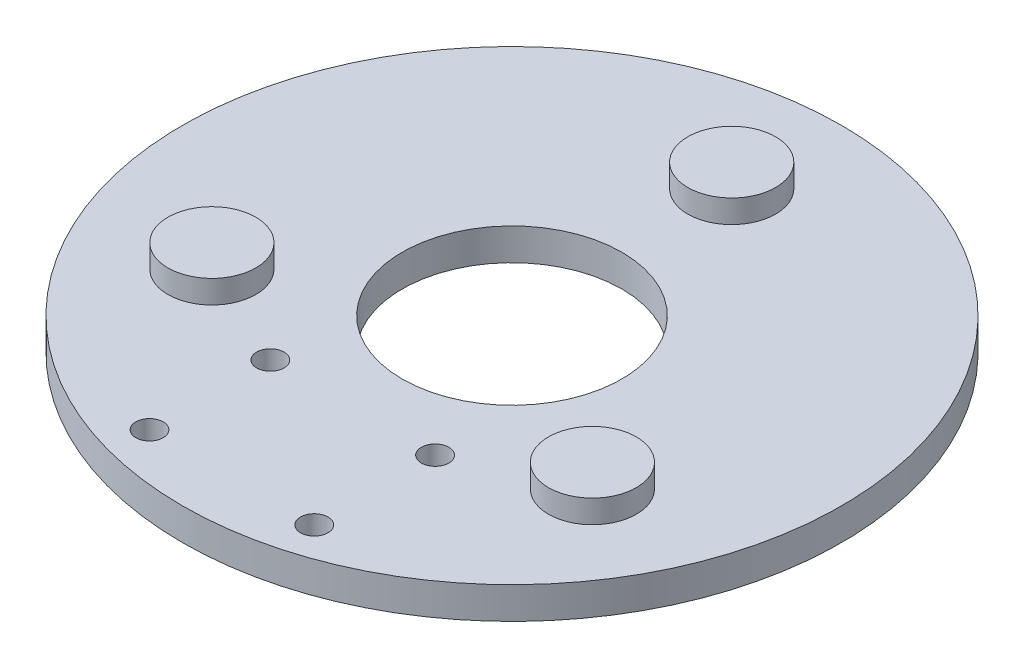
ISO-10303-21;
HEADER;
FILE_DESCRIPTION(('STEP AP214'),'2;1');
FILE_NAME('part.step','',(''),(''),'','','');
FILE_SCHEMA(('AUTOMOTIVE_DESIGN { 1 0 10303 214 1 1 1 1 }'));
ENDSEC;
DATA;
#1=APPLICATION_CONTEXT('core data for automotive mechanical design processes');
#2=APPLICATION_PROTOCOL_DEFINITION('international standard','automotive_design',2000,#1);
#3=PRODUCT_CONTEXT('',#1,'mechanical');
#4=PRODUCT('Part','Part','',(#3));
#5=PRODUCT_RELATED_PRODUCT_CATEGORY('part','',(#4));
#6=PRODUCT_DEFINITION_FORMATION('','',#4);
#7=PRODUCT_DEFINITION_CONTEXT('part definition',#1,'design');
#8=PRODUCT_DEFINITION('design','',#6,#7);
#9=PRODUCT_DEFINITION_SHAPE('','',#8);
#10=(LENGTH_UNIT() NAMED_UNIT(*) SI_UNIT(.MILLI.,.METRE.));
#11=(NAMED_UNIT(*) PLANE_ANGLE_UNIT() SI_UNIT($,.RADIAN.));
#12=(NAMED_UNIT(*) SI_UNIT($,.STERADIAN.) SOLID_ANGLE_UNIT());
#13=UNCERTAINTY_MEASURE_WITH_UNIT(LENGTH_MEASURE(1.E-05),#10,'distance_accuracy_value','');
#14=(GEOMETRIC_REPRESENTATION_CONTEXT(3) GLOBAL_UNCERTAINTY_ASSIGNED_CONTEXT((#13)) GLOBAL_UNIT_ASSIGNED_CONTEXT((#10,
#11,#12)) REPRESENTATION_CONTEXT('',''));
#15=CARTESIAN_POINT('',(0.,0.,0.));
#16=DIRECTION('',(0.,0.,1.));
#17=DIRECTION('',(1.,0.,0.));
#18=AXIS2_PLACEMENT_3D('',#15,#16,#17);
#19=CARTESIAN_POINT('',(0.,7.366,0.));
#20=DIRECTION('',(0.,1.,0.));
#21=DIRECTION('',(0.,0.,1.));
#22=AXIS2_PLACEMENT_3D('',#19,#20,#21);
#23=PLANE('',#22);
#24=CARTESIAN_POINT('',(19.05,7.366,64.77));
#25=DIRECTION('',(0.,1.,0.));
#26=DIRECTION('',(0.,0.,-1.));
#27=AXIS2_PLACEMENT_3D('',#24,#25,#26);
#28=CIRCLE('',#27,3.175);
#29=CARTESIAN_POINT('',(19.05,7.366,61.595));
#30=VERTEX_POINT('',#29);
#31=EDGE_CURVE('E86',#30,#30,#28,.T.);
#32=ORIENTED_EDGE('',*,*,#31,.F.);
#33=EDGE_LOOP('',(#32));
#34=FACE_BOUND('',#33,.T.);
#35=CARTESIAN_POINT('',(-19.05,7.366,36.83));
#36=DIRECTION('',(0.,1.,0.));
#37=DIRECTION('',(0.,0.,-1.));
#38=AXIS2_PLACEMENT_3D('',#35,#36,#37);
#39=CIRCLE('',#38,3.175);
#40=CARTESIAN_POINT('',(-19.05,7.366,33.655));
#41=VERTEX_POINT('',#40);
#42=EDGE_CURVE('E80',#41,#41,#39,.T.);
#43=ORIENTED_EDGE('',*,*,#42,.F.);
#44=EDGE_LOOP('',(#43));
#45=FACE_BOUND('',#44,.T.);
#46=CARTESIAN_POINT('',(19.05,7.366,36.83));
#47=DIRECTION('',(0.,1.,0.));
#48=DIRECTION('',(0.,0.,1.));
#49=AXIS2_PLACEMENT_3D('',#46,#47,#48);
#50=CIRCLE('',#49,3.175);
#51=CARTESIAN_POINT('',(19.05,7.366,40.005));
#52=VERTEX_POINT('',#51);
#53=EDGE_CURVE('E74',#52,#52,#50,.T.);
#54=ORIENTED_EDGE('',*,*,#53,.F.);
#55=EDGE_LOOP('',(#54));
#56=FACE_BOUND('',#55,.T.);
#57=CARTESIAN_POINT('',(-19.05,7.366,64.77));
#58=DIRECTION('',(0.,1.,0.));
#59=DIRECTION('',(0.,0.,1.));
#60=AXIS2_PLACEMENT_3D('',#57,#58,#59);
#61=CIRCLE('',#60,3.175);
#62=CARTESIAN_POINT('',(-19.05,7.366,67.945));
#63=VERTEX_POINT('',#62);
#64=EDGE_CURVE('E68',#63,#63,#61,.T.);
#65=ORIENTED_EDGE('',*,*,#64,.F.);
#66=EDGE_LOOP('',(#65));
#67=FACE_BOUND('',#66,.T.);
#68=CARTESIAN_POINT('',(-43.9940905122494,7.366,25.4000000000002));
#69=DIRECTION('',(0.,1.,0.));
#70=DIRECTION('',(0.,0.,1.));
#71=AXIS2_PLACEMENT_3D('',#68,#69,#70);
#72=CIRCLE('',#71,10.16);
#73=CARTESIAN_POINT('',(-43.9940905122494,7.366,35.5600000000002));
#74=VERTEX_POINT('',#73);
#75=EDGE_CURVE('E56',#74,#74,#72,.T.);
#76=ORIENTED_EDGE('',*,*,#75,.F.);
#77=EDGE_LOOP('',(#76));
#78=FACE_BOUND('',#77,.T.);
#79=CARTESIAN_POINT('',(0.,7.366,0.));
#80=DIRECTION('',(0.,1.,0.));
#81=DIRECTION('',(0.,0.,1.));
#82=AXIS2_PLACEMENT_3D('',#79,#80,#81);
#83=CIRCLE('',#82,25.4);
#84=CARTESIAN_POINT('',(0.,7.366,25.4));
#85=VERTEX_POINT('',#84);
#86=EDGE_CURVE('E42',#85,#85,#83,.T.);
#87=ORIENTED_EDGE('',*,*,#86,.F.);
#88=EDGE_LOOP('',(#87));
#89=FACE_BOUND('',#88,.T.);
#90=CARTESIAN_POINT('',(0.,7.366,0.));
#91=DIRECTION('',(0.,1.,0.));
#92=DIRECTION('',(0.,0.,1.));
#93=AXIS2_PLACEMENT_3D('',#90,#91,#92);
#94=CIRCLE('',#93,76.2);
#95=CARTESIAN_POINT('',(0.,7.366,76.2));
#96=VERTEX_POINT('',#95);
#97=EDGE_CURVE('E10',#96,#96,#94,.T.);
#98=ORIENTED_EDGE('',*,*,#97,.T.);
#99=EDGE_LOOP('',(#98));
#100=FACE_BOUND('',#99,.T.);
#101=CARTESIAN_POINT('',(0.,7.366,-50.8));
#102=DIRECTION('',(0.,1.,0.));
#103=DIRECTION('',(0.,0.,1.));
#104=AXIS2_PLACEMENT_3D('',#101,#102,#103);
#105=CIRCLE('',#104,10.16);
#106=CARTESIAN_POINT('',(0.,7.366,-40.64));
#107=VERTEX_POINT('',#106);
#108=EDGE_CURVE('E50',#107,#107,#105,.T.);
#109=ORIENTED_EDGE('',*,*,#108,.F.);
#110=EDGE_LOOP('',(#109));
#111=FACE_BOUND('',#110,.T.);
#112=CARTESIAN_POINT('',(43.9940905122497,7.366,25.3999999999996));
#113=DIRECTION('',(0.,1.,0.));
#114=DIRECTION('',(0.,0.,1.));
#115=AXIS2_PLACEMENT_3D('',#112,#113,#114);
#116=CIRCLE('',#115,10.16);
#117=CARTESIAN_POINT('',(43.9940905122497,7.366,35.5599999999996));
#118=VERTEX_POINT('',#117);
#119=EDGE_CURVE('E62',#118,#118,#116,.T.);
#120=ORIENTED_EDGE('',*,*,#119,.F.);
#121=EDGE_LOOP('',(#120));
#122=FACE_BOUND('',#121,.T.);
#123=ADVANCED_FACE('F31',(#34,#45,#56,#67,#78,#89,#100,#111,#122),#23,.T.);
#124=CARTESIAN_POINT('',(0.,0.,0.));
#125=DIRECTION('',(0.,1.,0.));
#126=DIRECTION('',(0.,0.,1.));
#127=AXIS2_PLACEMENT_3D('',#124,#125,#126);
#128=PLANE('',#127);
#129=CARTESIAN_POINT('',(19.05,0.,64.77));
#130=DIRECTION('',(0.,1.,0.));
#131=DIRECTION('',(0.,0.,-1.));
#132=AXIS2_PLACEMENT_3D('',#129,#130,#131);
#133=CIRCLE('',#132,3.175);
#134=CARTESIAN_POINT('',(19.05,0.,61.595));
#135=VERTEX_POINT('',#134);
#136=EDGE_CURVE('E83',#135,#135,#133,.T.);
#137=ORIENTED_EDGE('',*,*,#136,.T.);
#138=EDGE_LOOP('',(#137));
#139=FACE_BOUND('',#138,.T.);
#140=CARTESIAN_POINT('',(-19.05,0.,36.83));
#141=DIRECTION('',(0.,1.,0.));
#142=DIRECTION('',(0.,0.,-1.));
#143=AXIS2_PLACEMENT_3D('',#140,#141,#142);
#144=CIRCLE('',#143,3.175);
#145=CARTESIAN_POINT('',(-19.05,0.,33.655));
#146=VERTEX_POINT('',#145);
#147=EDGE_CURVE('E77',#146,#146,#144,.T.);
#148=ORIENTED_EDGE('',*,*,#147,.T.);
#149=EDGE_LOOP('',(#148));
#150=FACE_BOUND('',#149,.T.);
#151=CARTESIAN_POINT('',(19.05,0.,36.83));
#152=DIRECTION('',(0.,1.,0.));
#153=DIRECTION('',(0.,0.,1.));
#154=AXIS2_PLACEMENT_3D('',#151,#152,#153);
#155=CIRCLE('',#154,3.175);
#156=CARTESIAN_POINT('',(19.05,0.,40.005));
#157=VERTEX_POINT('',#156);
#158=EDGE_CURVE('E71',#157,#157,#155,.T.);
#159=ORIENTED_EDGE('',*,*,#158,.T.);
#160=EDGE_LOOP('',(#159));
#161=FACE_BOUND('',#160,.T.);
#162=CARTESIAN_POINT('',(-19.05,0.,64.77));
#163=DIRECTION('',(0.,1.,0.));
#164=DIRECTION('',(0.,0.,1.));
#165=AXIS2_PLACEMENT_3D('',#162,#163,#164);
#166=CIRCLE('',#165,3.175);
#167=CARTESIAN_POINT('',(-19.05,0.,67.945));
#168=VERTEX_POINT('',#167);
#169=EDGE_CURVE('E65',#168,#168,#166,.T.);
#170=ORIENTED_EDGE('',*,*,#169,.T.);
#171=EDGE_LOOP('',(#170));
#172=FACE_BOUND('',#171,.T.);
#173=CARTESIAN_POINT('',(0.,0.,0.));
#174=DIRECTION('',(0.,1.,0.));
#175=DIRECTION('',(0.,0.,1.));
#176=AXIS2_PLACEMENT_3D('',#173,#174,#175);
#177=CIRCLE('',#176,76.2);
#178=CARTESIAN_POINT('',(0.,0.,76.2));
#179=VERTEX_POINT('',#178);
#180=EDGE_CURVE('E35',#179,#179,#177,.T.);
#181=ORIENTED_EDGE('',*,*,#180,.F.);
#182=EDGE_LOOP('',(#181));
#183=FACE_BOUND('',#182,.T.);
#184=CARTESIAN_POINT('',(0.,0.,0.));
#185=DIRECTION('',(0.,1.,0.));
#186=DIRECTION('',(0.,0.,1.));
#187=AXIS2_PLACEMENT_3D('',#184,#185,#186);
#188=CIRCLE('',#187,25.4);
#189=CARTESIAN_POINT('',(0.,0.,25.4));
#190=VERTEX_POINT('',#189);
#191=EDGE_CURVE('E44',#190,#190,#188,.T.);
#192=ORIENTED_EDGE('',*,*,#191,.T.);
#193=EDGE_LOOP('',(#192));
#194=FACE_BOUND('',#193,.T.);
#195=ADVANCED_FACE('F92',(#139,#150,#161,#172,#183,#194),#128,.F.);
#196=CARTESIAN_POINT('',(0.,7.366,0.));
#197=DIRECTION('',(0.,-1.,0.));
#198=DIRECTION('',(0.,0.,-1.));
#199=AXIS2_PLACEMENT_3D('',#196,#197,#198);
#200=CYLINDRICAL_SURFACE('',#199,76.2);
#201=ORIENTED_EDGE('',*,*,#97,.F.);
#202=EDGE_LOOP('',(#201));
#203=FACE_BOUND('',#202,.T.);
#204=ORIENTED_EDGE('',*,*,#180,.T.);
#205=EDGE_LOOP('',(#204));
#206=FACE_BOUND('',#205,.T.);
#207=ADVANCED_FACE('F33',(#203,#206),#200,.T.);
#208=CARTESIAN_POINT('',(0.,7.366,0.));
#209=DIRECTION('',(0.,-1.,0.));
#210=DIRECTION('',(0.,0.,-1.));
#211=AXIS2_PLACEMENT_3D('',#208,#209,#210);
#212=CYLINDRICAL_SURFACE('',#211,25.4);
#213=ORIENTED_EDGE('',*,*,#86,.T.);
#214=EDGE_LOOP('',(#213));
#215=FACE_BOUND('',#214,.T.);
#216=ORIENTED_EDGE('',*,*,#191,.F.);
#217=EDGE_LOOP('',(#216));
#218=FACE_BOUND('',#217,.T.);
#219=ADVANCED_FACE('F148',(#215,#218),#212,.F.);
#220=CARTESIAN_POINT('',(0.,12.7,-50.8));
#221=DIRECTION('',(0.,-1.,0.));
#222=DIRECTION('',(0.,0.,-1.));
#223=AXIS2_PLACEMENT_3D('',#220,#221,#222);
#224=CYLINDRICAL_SURFACE('',#223,10.16);
#225=CARTESIAN_POINT('',(0.,12.7,-50.8));
#226=DIRECTION('',(0.,1.,0.));
#227=DIRECTION('',(0.,0.,1.));
#228=AXIS2_PLACEMENT_3D('',#225,#226,#227);
#229=CIRCLE('',#228,10.16);
#230=CARTESIAN_POINT('',(0.,12.7,-40.64));
#231=VERTEX_POINT('',#230);
#232=EDGE_CURVE('E47',#231,#231,#229,.T.);
#233=ORIENTED_EDGE('',*,*,#232,.F.);
#234=EDGE_LOOP('',(#233));
#235=FACE_BOUND('',#234,.T.);
#236=ORIENTED_EDGE('',*,*,#108,.T.);
#237=EDGE_LOOP('',(#236));
#238=FACE_BOUND('',#237,.T.);
#239=ADVANCED_FACE('F144',(#235,#238),#224,.T.);
#240=CARTESIAN_POINT('',(0.,12.7,-50.8));
#241=DIRECTION('',(0.,1.,0.));
#242=DIRECTION('',(0.,0.,1.));
#243=AXIS2_PLACEMENT_3D('',#240,#241,#242);
#244=PLANE('',#243);
#245=ORIENTED_EDGE('',*,*,#232,.T.);
#246=EDGE_LOOP('',(#245));
#247=FACE_BOUND('',#246,.T.);
#248=ADVANCED_FACE('F140',(#247),#244,.T.);
#249=CARTESIAN_POINT('',(-43.9940905122494,12.7,25.4000000000002));
#250=DIRECTION('',(0.,-1.,0.));
#251=DIRECTION('',(0.,0.,-1.));
#252=AXIS2_PLACEMENT_3D('',#249,#250,#251);
#253=CYLINDRICAL_SURFACE('',#252,10.16);
#254=CARTESIAN_POINT('',(-43.9940905122494,12.7,25.4000000000002));
#255=DIRECTION('',(0.,1.,0.));
#256=DIRECTION('',(0.,0.,1.));
#257=AXIS2_PLACEMENT_3D('',#254,#255,#256);
#258=CIRCLE('',#257,10.16);
#259=CARTESIAN_POINT('',(-43.9940905122494,12.7,35.5600000000002));
#260=VERTEX_POINT('',#259);
#261=EDGE_CURVE('E53',#260,#260,#258,.T.);
#262=ORIENTED_EDGE('',*,*,#261,.F.);
#263=EDGE_LOOP('',(#262));
#264=FACE_BOUND('',#263,.T.);
#265=ORIENTED_EDGE('',*,*,#75,.T.);
#266=EDGE_LOOP('',(#265));
#267=FACE_BOUND('',#266,.T.);
#268=ADVANCED_FACE('F132',(#264,#267),#253,.T.);
#269=CARTESIAN_POINT('',(-43.9940905122494,12.7,25.4000000000002));
#270=DIRECTION('',(0.,1.,0.));
#271=DIRECTION('',(0.,0.,1.));
#272=AXIS2_PLACEMENT_3D('',#269,#270,#271);
#273=PLANE('',#272);
#274=ORIENTED_EDGE('',*,*,#261,.T.);
#275=EDGE_LOOP('',(#274));
#276=FACE_BOUND('',#275,.T.);
#277=ADVANCED_FACE('F122',(#276),#273,.T.);
#278=CARTESIAN_POINT('',(43.9940905122497,12.7,25.3999999999996));
#279=DIRECTION('',(0.,-1.,0.));
#280=DIRECTION('',(0.,0.,-1.));
#281=AXIS2_PLACEMENT_3D('',#278,#279,#280);
#282=CYLINDRICAL_SURFACE('',#281,10.16);
#283=CARTESIAN_POINT('',(43.9940905122497,12.7,25.3999999999996));
#284=DIRECTION('',(0.,1.,0.));
#285=DIRECTION('',(0.,0.,1.));
#286=AXIS2_PLACEMENT_3D('',#283,#284,#285);
#287=CIRCLE('',#286,10.16);
#288=CARTESIAN_POINT('',(43.9940905122497,12.7,35.5599999999996));
#289=VERTEX_POINT('',#288);
#290=EDGE_CURVE('E59',#289,#289,#287,.T.);
#291=ORIENTED_EDGE('',*,*,#290,.F.);
#292=EDGE_LOOP('',(#291));
#293=FACE_BOUND('',#292,.T.);
#294=ORIENTED_EDGE('',*,*,#119,.T.);
#295=EDGE_LOOP('',(#294));
#296=FACE_BOUND('',#295,.T.);
#297=ADVANCED_FACE('F119',(#293,#296),#282,.T.);
#298=CARTESIAN_POINT('',(43.9940905122497,12.7,25.3999999999996));
#299=DIRECTION('',(0.,1.,0.));
#300=DIRECTION('',(0.,0.,1.));
#301=AXIS2_PLACEMENT_3D('',#298,#299,#300);
#302=PLANE('',#301);
#303=ORIENTED_EDGE('',*,*,#290,.T.);
#304=EDGE_LOOP('',(#303));
#305=FACE_BOUND('',#304,.T.);
#306=ADVANCED_FACE('F121',(#305),#302,.T.);
#307=CARTESIAN_POINT('',(-19.05,0.,64.77));
#308=DIRECTION('',(0.,1.,0.));
#309=DIRECTION('',(0.,0.,1.));
#310=AXIS2_PLACEMENT_3D('',#307,#308,#309);
#311=CYLINDRICAL_SURFACE('',#310,3.175);
#312=ORIENTED_EDGE('',*,*,#169,.F.);
#313=EDGE_LOOP('',(#312));
#314=FACE_BOUND('',#313,.T.);
#315=ORIENTED_EDGE('',*,*,#64,.T.);
#316=EDGE_LOOP('',(#315));
#317=FACE_BOUND('',#316,.T.);
#318=ADVANCED_FACE('F129',(#314,#317),#311,.F.);
#319=CARTESIAN_POINT('',(19.05,0.,36.83));
#320=DIRECTION('',(0.,1.,0.));
#321=DIRECTION('',(0.,0.,1.));
#322=AXIS2_PLACEMENT_3D('',#319,#320,#321);
#323=CYLINDRICAL_SURFACE('',#322,3.175);
#324=ORIENTED_EDGE('',*,*,#158,.F.);
#325=EDGE_LOOP('',(#324));
#326=FACE_BOUND('',#325,.T.);
#327=ORIENTED_EDGE('',*,*,#53,.T.);
#328=EDGE_LOOP('',(#327));
#329=FACE_BOUND('',#328,.T.);
#330=ADVANCED_FACE('F214',(#326,#329),#323,.F.);
#331=CARTESIAN_POINT('',(-19.05,0.,36.83));
#332=DIRECTION('',(0.,1.,0.));
#333=DIRECTION('',(0.,0.,1.));
#334=AXIS2_PLACEMENT_3D('',#331,#332,#333);
#335=CYLINDRICAL_SURFACE('',#334,3.175);
#336=ORIENTED_EDGE('',*,*,#147,.F.);
#337=EDGE_LOOP('',(#336));
#338=FACE_BOUND('',#337,.T.);
#339=ORIENTED_EDGE('',*,*,#42,.T.);
#340=EDGE_LOOP('',(#339));
#341=FACE_BOUND('',#340,.T.);
#342=ADVANCED_FACE('F98',(#338,#341),#335,.F.);
#343=CARTESIAN_POINT('',(19.05,0.,64.77));
#344=DIRECTION('',(0.,1.,0.));
#345=DIRECTION('',(0.,0.,1.));
#346=AXIS2_PLACEMENT_3D('',#343,#344,#345);
#347=CYLINDRICAL_SURFACE('',#346,3.175);
#348=ORIENTED_EDGE('',*,*,#136,.F.);
#349=EDGE_LOOP('',(#348));
#350=FACE_BOUND('',#349,.T.);
#351=ORIENTED_EDGE('',*,*,#31,.T.);
#352=EDGE_LOOP('',(#351));
#353=FACE_BOUND('',#352,.T.);
#354=ADVANCED_FACE('F95',(#350,#353),#347,.F.);
#355=CLOSED_SHELL('',(#123,#195,#207,#219,#239,#248,#268,#277,#297,#306,#318,#330,#342,#354));
#356=MANIFOLD_SOLID_BREP('B2',#355);
#357=ADVANCED_BREP_SHAPE_REPRESENTATION('',(#18,#356),#14);
#358=SHAPE_DEFINITION_REPRESENTATION(#9,#357);
ENDSEC;
END-ISO-10303-21;
